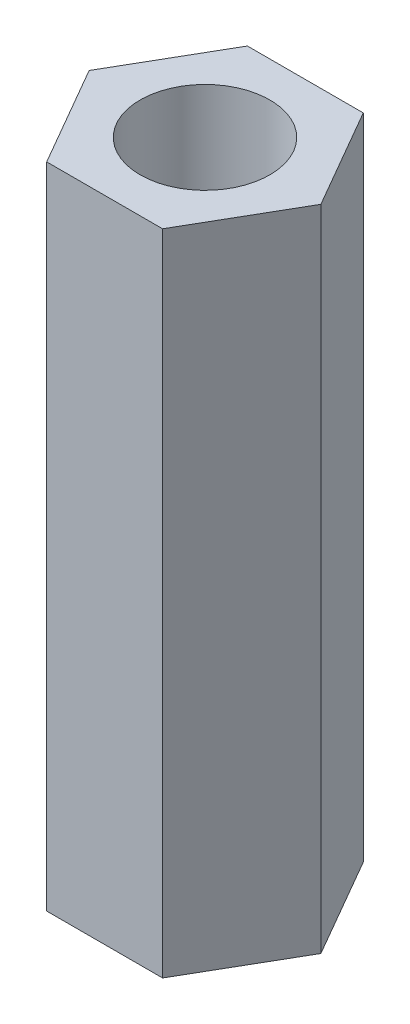
ISO-10303-21;
HEADER;
FILE_DESCRIPTION(('STEP AP214'),'2;1');
FILE_NAME('part.step','',(''),(''),'','','');
FILE_SCHEMA(('AUTOMOTIVE_DESIGN { 1 0 10303 214 1 1 1 1 }'));
ENDSEC;
DATA;
#1=APPLICATION_CONTEXT('core data for automotive mechanical design processes');
#2=APPLICATION_PROTOCOL_DEFINITION('international standard','automotive_design',2000,#1);
#3=PRODUCT_CONTEXT('',#1,'mechanical');
#4=PRODUCT('Part','Part','',(#3));
#5=PRODUCT_RELATED_PRODUCT_CATEGORY('part','',(#4));
#6=PRODUCT_DEFINITION_FORMATION('','',#4);
#7=PRODUCT_DEFINITION_CONTEXT('part definition',#1,'design');
#8=PRODUCT_DEFINITION('design','',#6,#7);
#9=PRODUCT_DEFINITION_SHAPE('','',#8);
#10=(LENGTH_UNIT() NAMED_UNIT(*) SI_UNIT(.MILLI.,.METRE.));
#11=(NAMED_UNIT(*) PLANE_ANGLE_UNIT() SI_UNIT($,.RADIAN.));
#12=(NAMED_UNIT(*) SI_UNIT($,.STERADIAN.) SOLID_ANGLE_UNIT());
#13=UNCERTAINTY_MEASURE_WITH_UNIT(LENGTH_MEASURE(1.E-05),#10,'distance_accuracy_value','');
#14=(GEOMETRIC_REPRESENTATION_CONTEXT(3) GLOBAL_UNCERTAINTY_ASSIGNED_CONTEXT((#13)) GLOBAL_UNIT_ASSIGNED_CONTEXT((#10,
#11,#12)) REPRESENTATION_CONTEXT('',''));
#15=CARTESIAN_POINT('',(0.,0.,0.));
#16=DIRECTION('',(0.,0.,1.));
#17=DIRECTION('',(1.,0.,0.));
#18=AXIS2_PLACEMENT_3D('',#15,#16,#17);
#19=CARTESIAN_POINT('',(0.,7.5,0.));
#20=DIRECTION('',(0.,1.,0.));
#21=DIRECTION('',(0.,0.,1.));
#22=AXIS2_PLACEMENT_3D('',#19,#20,#21);
#23=PLANE('',#22);
#24=DIRECTION('',(0.499999999999995,0.,-0.866025403784442));
#25=VECTOR('',#24,1.);
#26=CARTESIAN_POINT('',(1.33945262451996,7.5,2.31999999999999));
#27=LINE('',#26,#25);
#28=CARTESIAN_POINT('',(1.33945262451996,7.5,2.31999999999999));
#29=VERTEX_POINT('',#28);
#30=CARTESIAN_POINT('',(2.67890524903987,7.5,0.));
#31=VERTEX_POINT('',#30);
#32=EDGE_CURVE('E146',#29,#31,#27,.T.);
#33=ORIENTED_EDGE('',*,*,#32,.T.);
#34=DIRECTION('',(-0.500000000000001,0.,-0.866025403784438));
#35=VECTOR('',#34,1.);
#36=CARTESIAN_POINT('',(2.67890524903987,7.5,0.));
#37=LINE('',#36,#35);
#38=CARTESIAN_POINT('',(1.33945262451993,7.5,-2.32));
#39=VERTEX_POINT('',#38);
#40=EDGE_CURVE('E94',#31,#39,#37,.T.);
#41=ORIENTED_EDGE('',*,*,#40,.T.);
#42=DIRECTION('',(-1.,0.,0.));
#43=VECTOR('',#42,1.);
#44=CARTESIAN_POINT('',(1.33945262451993,7.5,-2.32));
#45=LINE('',#44,#43);
#46=CARTESIAN_POINT('',(-1.33945262451994,7.5,-2.32));
#47=VERTEX_POINT('',#46);
#48=EDGE_CURVE('E107',#39,#47,#45,.T.);
#49=ORIENTED_EDGE('',*,*,#48,.T.);
#50=DIRECTION('',(-0.499999999999995,0.,0.866025403784442));
#51=VECTOR('',#50,1.);
#52=CARTESIAN_POINT('',(-1.33945262451994,7.5,-2.32));
#53=LINE('',#52,#51);
#54=CARTESIAN_POINT('',(-2.67890524903986,7.5,0.));
#55=VERTEX_POINT('',#54);
#56=EDGE_CURVE('E101',#47,#55,#53,.T.);
#57=ORIENTED_EDGE('',*,*,#56,.T.);
#58=DIRECTION('',(0.500000000000007,0.,0.866025403784435));
#59=VECTOR('',#58,1.);
#60=CARTESIAN_POINT('',(-2.67890524903986,7.5,0.));
#61=LINE('',#60,#59);
#62=CARTESIAN_POINT('',(-1.33945262451991,7.5,2.32000000000001));
#63=VERTEX_POINT('',#62);
#64=EDGE_CURVE('E105',#55,#63,#61,.T.);
#65=ORIENTED_EDGE('',*,*,#64,.T.);
#66=DIRECTION('',(1.,0.,0.));
#67=VECTOR('',#66,1.);
#68=CARTESIAN_POINT('',(-1.33945262451991,7.5,2.32000000000001));
#69=LINE('',#68,#67);
#70=EDGE_CURVE('E57',#63,#29,#69,.T.);
#71=ORIENTED_EDGE('',*,*,#70,.T.);
#72=EDGE_LOOP('',(#33,#41,#49,#57,#65,#71));
#73=FACE_BOUND('',#72,.T.);
#74=CARTESIAN_POINT('',(0.,7.5,0.));
#75=DIRECTION('',(0.,1.,0.));
#76=DIRECTION('',(0.,0.,1.));
#77=AXIS2_PLACEMENT_3D('',#74,#75,#76);
#78=CIRCLE('',#77,1.5);
#79=CARTESIAN_POINT('',(0.,7.5,1.5));
#80=VERTEX_POINT('',#79);
#81=EDGE_CURVE('E134',#80,#80,#78,.T.);
#82=ORIENTED_EDGE('',*,*,#81,.F.);
#83=EDGE_LOOP('',(#82));
#84=FACE_BOUND('',#83,.T.);
#85=ADVANCED_FACE('F39',(#73,#84),#23,.T.);
#86=CARTESIAN_POINT('',(0.,-7.5,0.));
#87=DIRECTION('',(0.,1.,0.));
#88=DIRECTION('',(0.,0.,1.));
#89=AXIS2_PLACEMENT_3D('',#86,#87,#88);
#90=PLANE('',#89);
#91=DIRECTION('',(0.499999999999995,0.,-0.866025403784442));
#92=VECTOR('',#91,1.);
#93=CARTESIAN_POINT('',(1.33945262451996,-7.5,2.31999999999999));
#94=LINE('',#93,#92);
#95=CARTESIAN_POINT('',(1.33945262451996,-7.5,2.31999999999999));
#96=VERTEX_POINT('',#95);
#97=CARTESIAN_POINT('',(2.67890524903987,-7.5,0.));
#98=VERTEX_POINT('',#97);
#99=EDGE_CURVE('E129',#96,#98,#94,.T.);
#100=ORIENTED_EDGE('',*,*,#99,.F.);
#101=DIRECTION('',(1.,0.,0.));
#102=VECTOR('',#101,1.);
#103=CARTESIAN_POINT('',(-1.33945262451991,-7.5,2.32000000000001));
#104=LINE('',#103,#102);
#105=CARTESIAN_POINT('',(-1.33945262451991,-7.5,2.32000000000001));
#106=VERTEX_POINT('',#105);
#107=EDGE_CURVE('E86',#106,#96,#104,.T.);
#108=ORIENTED_EDGE('',*,*,#107,.F.);
#109=DIRECTION('',(0.500000000000007,0.,0.866025403784435));
#110=VECTOR('',#109,1.);
#111=CARTESIAN_POINT('',(-2.67890524903986,-7.5,0.));
#112=LINE('',#111,#110);
#113=CARTESIAN_POINT('',(-2.67890524903986,-7.5,0.));
#114=VERTEX_POINT('',#113);
#115=EDGE_CURVE('E80',#114,#106,#112,.T.);
#116=ORIENTED_EDGE('',*,*,#115,.F.);
#117=DIRECTION('',(-0.499999999999995,0.,0.866025403784442));
#118=VECTOR('',#117,1.);
#119=CARTESIAN_POINT('',(-1.33945262451994,-7.5,-2.32));
#120=LINE('',#119,#118);
#121=CARTESIAN_POINT('',(-1.33945262451994,-7.5,-2.32));
#122=VERTEX_POINT('',#121);
#123=EDGE_CURVE('E116',#122,#114,#120,.T.);
#124=ORIENTED_EDGE('',*,*,#123,.F.);
#125=DIRECTION('',(-1.,0.,0.));
#126=VECTOR('',#125,1.);
#127=CARTESIAN_POINT('',(1.33945262451993,-7.5,-2.32));
#128=LINE('',#127,#126);
#129=CARTESIAN_POINT('',(1.33945262451993,-7.5,-2.32));
#130=VERTEX_POINT('',#129);
#131=EDGE_CURVE('E137',#130,#122,#128,.T.);
#132=ORIENTED_EDGE('',*,*,#131,.F.);
#133=DIRECTION('',(-0.500000000000001,0.,-0.866025403784438));
#134=VECTOR('',#133,1.);
#135=CARTESIAN_POINT('',(2.67890524903987,-7.5,0.));
#136=LINE('',#135,#134);
#137=EDGE_CURVE('E133',#98,#130,#136,.T.);
#138=ORIENTED_EDGE('',*,*,#137,.F.);
#139=EDGE_LOOP('',(#100,#108,#116,#124,#132,#138));
#140=FACE_BOUND('',#139,.T.);
#141=CARTESIAN_POINT('',(0.,-7.5,0.));
#142=DIRECTION('',(0.,1.,0.));
#143=DIRECTION('',(0.,0.,1.));
#144=AXIS2_PLACEMENT_3D('',#141,#142,#143);
#145=CIRCLE('',#144,1.5);
#146=CARTESIAN_POINT('',(0.,-7.5,1.5));
#147=VERTEX_POINT('',#146);
#148=EDGE_CURVE('E243',#147,#147,#145,.T.);
#149=ORIENTED_EDGE('',*,*,#148,.T.);
#150=EDGE_LOOP('',(#149));
#151=FACE_BOUND('',#150,.T.);
#152=ADVANCED_FACE('F159',(#140,#151),#90,.F.);
#153=CARTESIAN_POINT('',(1.33945262451996,7.5,2.31999999999999));
#154=DIRECTION('',(-0.866025403784442,0.,-0.499999999999995));
#155=DIRECTION('',(-0.499999999999995,0.,0.866025403784442));
#156=AXIS2_PLACEMENT_3D('',#153,#154,#155);
#157=PLANE('',#156);
#158=ORIENTED_EDGE('',*,*,#99,.T.);
#159=DIRECTION('',(0.,-1.,0.));
#160=VECTOR('',#159,1.);
#161=CARTESIAN_POINT('',(2.67890524903987,7.5,0.));
#162=LINE('',#161,#160);
#163=EDGE_CURVE('E11',#31,#98,#162,.T.);
#164=ORIENTED_EDGE('',*,*,#163,.F.);
#165=ORIENTED_EDGE('',*,*,#32,.F.);
#166=DIRECTION('',(0.,-1.,0.));
#167=VECTOR('',#166,1.);
#168=CARTESIAN_POINT('',(1.33945262451996,7.5,2.31999999999999));
#169=LINE('',#168,#167);
#170=EDGE_CURVE('E125',#29,#96,#169,.T.);
#171=ORIENTED_EDGE('',*,*,#170,.T.);
#172=EDGE_LOOP('',(#158,#164,#165,#171));
#173=FACE_BOUND('',#172,.T.);
#174=ADVANCED_FACE('F41',(#173),#157,.F.);
#175=CARTESIAN_POINT('',(2.67890524903987,7.5,0.));
#176=DIRECTION('',(-0.866025403784438,0.,0.500000000000001));
#177=DIRECTION('',(0.500000000000001,0.,0.866025403784438));
#178=AXIS2_PLACEMENT_3D('',#175,#176,#177);
#179=PLANE('',#178);
#180=ORIENTED_EDGE('',*,*,#137,.T.);
#181=DIRECTION('',(0.,-1.,0.));
#182=VECTOR('',#181,1.);
#183=CARTESIAN_POINT('',(1.33945262451993,7.5,-2.32));
#184=LINE('',#183,#182);
#185=EDGE_CURVE('E49',#39,#130,#184,.T.);
#186=ORIENTED_EDGE('',*,*,#185,.F.);
#187=ORIENTED_EDGE('',*,*,#40,.F.);
#188=ORIENTED_EDGE('',*,*,#163,.T.);
#189=EDGE_LOOP('',(#180,#186,#187,#188));
#190=FACE_BOUND('',#189,.T.);
#191=ADVANCED_FACE('F184',(#190),#179,.F.);
#192=CARTESIAN_POINT('',(1.33945262451993,7.5,-2.32));
#193=DIRECTION('',(0.,0.,1.));
#194=DIRECTION('',(1.,0.,0.));
#195=AXIS2_PLACEMENT_3D('',#192,#193,#194);
#196=PLANE('',#195);
#197=ORIENTED_EDGE('',*,*,#131,.T.);
#198=DIRECTION('',(0.,-1.,0.));
#199=VECTOR('',#198,1.);
#200=CARTESIAN_POINT('',(-1.33945262451994,7.5,-2.32));
#201=LINE('',#200,#199);
#202=EDGE_CURVE('E118',#47,#122,#201,.T.);
#203=ORIENTED_EDGE('',*,*,#202,.F.);
#204=ORIENTED_EDGE('',*,*,#48,.F.);
#205=ORIENTED_EDGE('',*,*,#185,.T.);
#206=EDGE_LOOP('',(#197,#203,#204,#205));
#207=FACE_BOUND('',#206,.T.);
#208=ADVANCED_FACE('F156',(#207),#196,.F.);
#209=CARTESIAN_POINT('',(-1.33945262451994,7.5,-2.32));
#210=DIRECTION('',(0.866025403784442,0.,0.499999999999995));
#211=DIRECTION('',(0.499999999999995,0.,-0.866025403784442));
#212=AXIS2_PLACEMENT_3D('',#209,#210,#211);
#213=PLANE('',#212);
#214=ORIENTED_EDGE('',*,*,#123,.T.);
#215=DIRECTION('',(0.,-1.,0.));
#216=VECTOR('',#215,1.);
#217=CARTESIAN_POINT('',(-2.67890524903986,7.5,0.));
#218=LINE('',#217,#216);
#219=EDGE_CURVE('E113',#55,#114,#218,.T.);
#220=ORIENTED_EDGE('',*,*,#219,.F.);
#221=ORIENTED_EDGE('',*,*,#56,.F.);
#222=ORIENTED_EDGE('',*,*,#202,.T.);
#223=EDGE_LOOP('',(#214,#220,#221,#222));
#224=FACE_BOUND('',#223,.T.);
#225=ADVANCED_FACE('F114',(#224),#213,.F.);
#226=CARTESIAN_POINT('',(-2.67890524903986,7.5,0.));
#227=DIRECTION('',(0.866025403784435,0.,-0.500000000000007));
#228=DIRECTION('',(-0.500000000000007,0.,-0.866025403784435));
#229=AXIS2_PLACEMENT_3D('',#226,#227,#228);
#230=PLANE('',#229);
#231=ORIENTED_EDGE('',*,*,#115,.T.);
#232=DIRECTION('',(0.,-1.,0.));
#233=VECTOR('',#232,1.);
#234=CARTESIAN_POINT('',(-1.33945262451991,7.5,2.32000000000001));
#235=LINE('',#234,#233);
#236=EDGE_CURVE('E119',#63,#106,#235,.T.);
#237=ORIENTED_EDGE('',*,*,#236,.F.);
#238=ORIENTED_EDGE('',*,*,#64,.F.);
#239=ORIENTED_EDGE('',*,*,#219,.T.);
#240=EDGE_LOOP('',(#231,#237,#238,#239));
#241=FACE_BOUND('',#240,.T.);
#242=ADVANCED_FACE('F121',(#241),#230,.F.);
#243=CARTESIAN_POINT('',(-1.33945262451991,7.5,2.32000000000001));
#244=DIRECTION('',(0.,0.,-1.));
#245=DIRECTION('',(-1.,0.,0.));
#246=AXIS2_PLACEMENT_3D('',#243,#244,#245);
#247=PLANE('',#246);
#248=ORIENTED_EDGE('',*,*,#107,.T.);
#249=ORIENTED_EDGE('',*,*,#170,.F.);
#250=ORIENTED_EDGE('',*,*,#70,.F.);
#251=ORIENTED_EDGE('',*,*,#236,.T.);
#252=EDGE_LOOP('',(#248,#249,#250,#251));
#253=FACE_BOUND('',#252,.T.);
#254=ADVANCED_FACE('F164',(#253),#247,.F.);
#255=CARTESIAN_POINT('',(0.,7.5,0.));
#256=DIRECTION('',(0.,-1.,0.));
#257=DIRECTION('',(0.,0.,-1.));
#258=AXIS2_PLACEMENT_3D('',#255,#256,#257);
#259=CYLINDRICAL_SURFACE('',#258,1.5);
#260=ORIENTED_EDGE('',*,*,#81,.T.);
#261=EDGE_LOOP('',(#260));
#262=FACE_BOUND('',#261,.T.);
#263=ORIENTED_EDGE('',*,*,#148,.F.);
#264=EDGE_LOOP('',(#263));
#265=FACE_BOUND('',#264,.T.);
#266=ADVANCED_FACE('F166',(#262,#265),#259,.F.);
#267=CLOSED_SHELL('',(#85,#152,#174,#191,#208,#225,#242,#254,#266));
#268=MANIFOLD_SOLID_BREP('B2',#267);
#269=ADVANCED_BREP_SHAPE_REPRESENTATION('',(#18,#268),#14);
#270=SHAPE_DEFINITION_REPRESENTATION(#9,#269);
ENDSEC;
END-ISO-10303-21;
